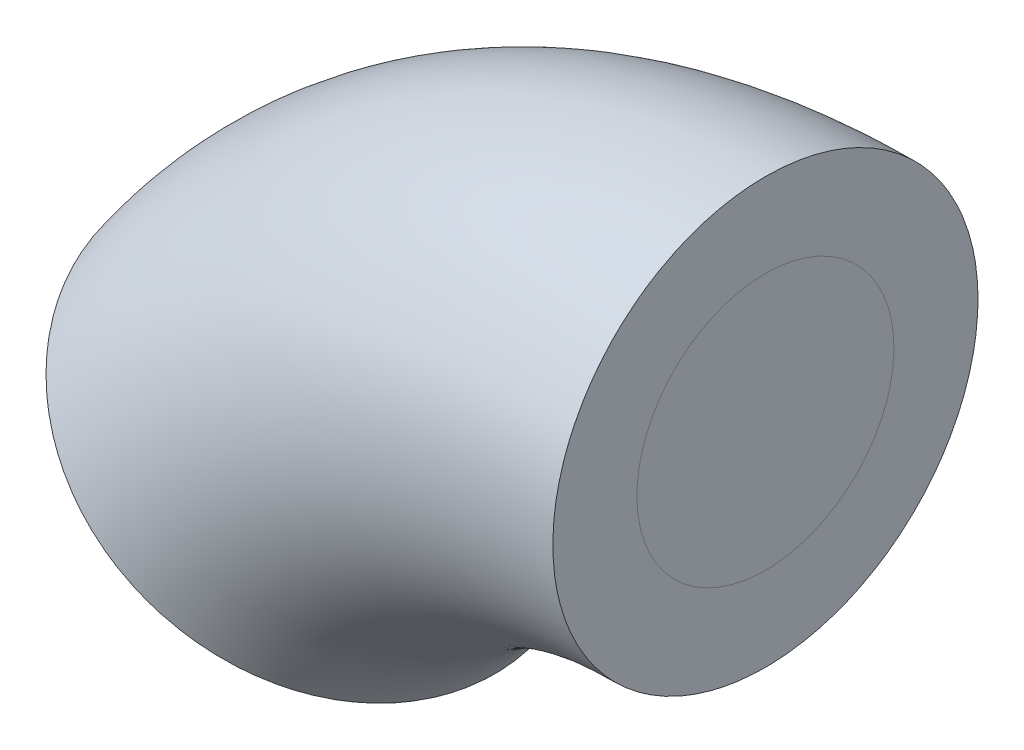
ISO-10303-21;
HEADER;
FILE_DESCRIPTION(('STEP AP214'),'2;1');
FILE_NAME('part.step','',(''),(''),'','','');
FILE_SCHEMA(('AUTOMOTIVE_DESIGN { 1 0 10303 214 1 1 1 1 }'));
ENDSEC;
DATA;
#1=APPLICATION_CONTEXT('core data for automotive mechanical design processes');
#2=APPLICATION_PROTOCOL_DEFINITION('international standard','automotive_design',2000,#1);
#3=PRODUCT_CONTEXT('',#1,'mechanical');
#4=PRODUCT('Part','Part','',(#3));
#5=PRODUCT_RELATED_PRODUCT_CATEGORY('part','',(#4));
#6=PRODUCT_DEFINITION_FORMATION('','',#4);
#7=PRODUCT_DEFINITION_CONTEXT('part definition',#1,'design');
#8=PRODUCT_DEFINITION('design','',#6,#7);
#9=PRODUCT_DEFINITION_SHAPE('','',#8);
#10=(LENGTH_UNIT() NAMED_UNIT(*) SI_UNIT(.MILLI.,.METRE.));
#11=(NAMED_UNIT(*) PLANE_ANGLE_UNIT() SI_UNIT($,.RADIAN.));
#12=(NAMED_UNIT(*) SI_UNIT($,.STERADIAN.) SOLID_ANGLE_UNIT());
#13=UNCERTAINTY_MEASURE_WITH_UNIT(LENGTH_MEASURE(1.E-05),#10,'distance_accuracy_value','');
#14=(GEOMETRIC_REPRESENTATION_CONTEXT(3) GLOBAL_UNCERTAINTY_ASSIGNED_CONTEXT((#13)) GLOBAL_UNIT_ASSIGNED_CONTEXT((#10,
#11,#12)) REPRESENTATION_CONTEXT('',''));
#15=CARTESIAN_POINT('',(0.,0.,0.));
#16=DIRECTION('',(0.,0.,1.));
#17=DIRECTION('',(1.,0.,0.));
#18=AXIS2_PLACEMENT_3D('',#15,#16,#17);
#19=CARTESIAN_POINT('',(-39.8288531987562,27.5832696008273,0.));
#20=DIRECTION('',(0.573576436350771,0.819152044289184,0.));
#21=DIRECTION('',(-0.819152044289184,0.573576436350771,0.));
#22=AXIS2_PLACEMENT_3D('',#19,#20,#21);
#23=PLANE('',#22);
#24=CARTESIAN_POINT('',(-91.4354319889623,63.7185850909438,0.));
#25=CARTESIAN_POINT('',(-91.4354319889623,63.7185850909438,-2.06167016246634));
#26=CARTESIAN_POINT('',(-91.1028653005238,63.4857193887419,-6.18495119527163));
#27=CARTESIAN_POINT('',(-89.6249737442699,62.450888580396,-12.1322656529812));
#28=CARTESIAN_POINT('',(-87.2251488980044,60.7705131326583,-17.6133047902747));
#29=CARTESIAN_POINT('',(-83.9954595333184,58.5090602934292,-22.4175252018825));
#30=CARTESIAN_POINT('',(-80.0601009921079,55.7534925773156,-26.3601940263774));
#31=CARTESIAN_POINT('',(-75.5702947094152,52.6096963730725,-29.2898722506689));
#32=CARTESIAN_POINT('',(-70.6985680389128,49.1984766342898,-31.0939547931055));
#33=CARTESIAN_POINT('',(-65.6321425938595,45.6509273458856,-31.7031213319892));
#34=CARTESIAN_POINT('',(-60.5657171488054,42.1033780574814,-31.0939547931056));
#35=CARTESIAN_POINT('',(-55.6939904783041,38.6921583186987,-29.289872250669));
#36=CARTESIAN_POINT('',(-51.20418419561,35.5483621144553,-26.3601940263774));
#37=CARTESIAN_POINT('',(-47.2688256544009,32.7927943983422,-22.4175252018826));
#38=CARTESIAN_POINT('',(-44.0391362897135,30.5313415591127,-17.6133047902748));
#39=CARTESIAN_POINT('',(-41.6393114434492,28.8509661113751,-12.1322656529813));
#40=CARTESIAN_POINT('',(-40.1614198871943,27.8161353030292,-6.18495119527165));
#41=CARTESIAN_POINT('',(-39.8288531987562,27.5832696008273,-2.06167016246634));
#42=CARTESIAN_POINT('',(-39.8288531987562,27.5832696008273,2.06167016246634));
#43=CARTESIAN_POINT('',(-40.1614198871945,27.8161353030292,6.18495119527163));
#44=CARTESIAN_POINT('',(-41.639311443449,28.8509661113751,12.1322656529812));
#45=CARTESIAN_POINT('',(-44.0391362897136,30.5313415591127,17.6133047902747));
#46=CARTESIAN_POINT('',(-47.2688256544006,32.7927943983421,22.4175252018825));
#47=CARTESIAN_POINT('',(-51.2041841956104,35.5483621144555,26.3601940263773));
#48=CARTESIAN_POINT('',(-55.6939904783037,38.6921583186984,29.2898722506689));
#49=CARTESIAN_POINT('',(-60.5657171488055,42.1033780574815,31.0939547931055));
#50=CARTESIAN_POINT('',(-65.6321425938594,45.6509273458855,31.7031213319893));
#51=CARTESIAN_POINT('',(-70.6985680389129,49.1984766342897,31.0939547931055));
#52=CARTESIAN_POINT('',(-75.5702947094149,52.6096963730726,29.289872250669));
#53=CARTESIAN_POINT('',(-80.0601009921084,55.7534925773156,26.3601940263773));
#54=CARTESIAN_POINT('',(-83.9954595333177,58.509060293429,22.4175252018826));
#55=CARTESIAN_POINT('',(-87.2251488980051,60.7705131326585,17.6133047902747));
#56=CARTESIAN_POINT('',(-89.6249737442695,62.4508885803959,12.1322656529812));
#57=CARTESIAN_POINT('',(-91.1028653005242,63.4857193887419,6.18495119527165));
#58=CARTESIAN_POINT('',(-91.4354319889623,63.7185850909438,2.06167016246634));
#59=CARTESIAN_POINT('',(-91.4354319889623,63.7185850909438,0.));
#60=B_SPLINE_CURVE_WITH_KNOTS('',3,(#24,#25,#26,#27,#28,#29,#30,#31,#32,#33,#34,#35,#36,#37,#38,
#39,#40,#41,#42,#43,#44,#45,#46,#47,#48,#49,#50,#51,#52,#53,#54,#55,#56,#57,#58,#59),
.UNSPECIFIED.,.T.,.F.,(4,1,1,1,1,1,1,1,1,1,1,1,1,1,1,1,2,1,1,1,1,1,1,1,1,1,1,1,1,1,1,1,4),(0.,
0.03125,0.0625,0.09375,0.125,0.15625,0.1875,0.21875,0.25,0.28125,0.3125,0.34375,0.375,0.40625,
0.4375,0.46875,0.5,0.53125,0.5625,0.59375,0.625,0.65625,0.6875,0.71875,0.75,0.78125,0.8125,
0.84375,0.875,0.90625,0.9375,0.96875,1.),.UNSPECIFIED.);
#61=CARTESIAN_POINT('',(-91.4354319889623,63.7185850909438,0.));
#62=VERTEX_POINT('',#61);
#63=EDGE_CURVE('E49',#62,#62,#60,.F.);
#64=ORIENTED_EDGE('',*,*,#63,.F.);
#65=EDGE_LOOP('',(#64));
#66=FACE_BOUND('',#65,.T.);
#67=CARTESIAN_POINT('',(-65.6321425938655,45.6509273458765,6.69075019069099E-05));
#68=DIRECTION('',(0.573576436350771,0.819152044289184,0.));
#69=DIRECTION('',(-0.819152044289184,0.573576436350771,0.));
#70=AXIS2_PLACEMENT_3D('',#67,#68,#69);
#71=CIRCLE('',#70,19.05);
#72=CARTESIAN_POINT('',(-81.2369890375744,56.5775584583587,6.69075019069099E-05));
#73=VERTEX_POINT('',#72);
#74=EDGE_CURVE('E10',#73,#73,#71,.F.);
#75=ORIENTED_EDGE('',*,*,#74,.F.);
#76=EDGE_LOOP('',(#75));
#77=FACE_BOUND('',#76,.T.);
#78=ADVANCED_FACE('F34',(#66,#77),#23,.F.);
#79=CARTESIAN_POINT('',(0.250000000000005,48.447,0.));
#80=DIRECTION('',(1.,0.,0.));
#81=DIRECTION('',(0.,1.,0.));
#82=AXIS2_PLACEMENT_3D('',#79,#80,#81);
#83=PLANE('',#82);
#84=CARTESIAN_POINT('',(0.250000000000005,111.447,0.));
#85=CARTESIAN_POINT('',(0.250000000000005,111.447,-2.06167016246634));
#86=CARTESIAN_POINT('',(0.250000000000005,111.041011037686,-6.18495119527165));
#87=CARTESIAN_POINT('',(0.250000000000005,109.236838580865,-12.1322656529812));
#88=CARTESIAN_POINT('',(0.250000000000005,106.307193391067,-17.6133047902748));
#89=CARTESIAN_POINT('',(0.250000000000005,102.364470685064,-22.4175252018824));
#90=CARTESIAN_POINT('',(0.250000000000005,97.56028498029,-26.3601940263775));
#91=CARTESIAN_POINT('',(0.250000000000005,92.0792435619162,-29.2898722506688));
#92=CARTESIAN_POINT('',(0.250000000000005,86.1319634391759,-31.0939547931055));
#93=CARTESIAN_POINT('',(0.250000000000005,79.9470000000004,-31.7031213319893));
#94=CARTESIAN_POINT('',(0.250000000000005,73.7620365608236,-31.0939547931054));
#95=CARTESIAN_POINT('',(0.250000000000005,67.814756438084,-29.289872250669));
#96=CARTESIAN_POINT('',(0.250000000000005,62.3337150197099,-26.3601940263773));
#97=CARTESIAN_POINT('',(0.250000000000006,57.529529314936,-22.4175252018826));
#98=CARTESIAN_POINT('',(0.250000000000005,53.5868066089328,-17.6133047902747));
#99=CARTESIAN_POINT('',(0.250000000000005,50.6571614191347,-12.1322656529812));
#100=CARTESIAN_POINT('',(0.250000000000005,48.852988962314,-6.18495119527164));
#101=CARTESIAN_POINT('',(0.250000000000005,48.447,-2.06167016246634));
#102=CARTESIAN_POINT('',(0.250000000000005,48.447,2.06167016246635));
#103=CARTESIAN_POINT('',(0.250000000000005,48.8529889623139,6.18495119527163));
#104=CARTESIAN_POINT('',(0.250000000000006,50.6571614191346,12.1322656529812));
#105=CARTESIAN_POINT('',(0.250000000000005,53.5868066089329,17.6133047902746));
#106=CARTESIAN_POINT('',(0.250000000000006,57.5295293149358,22.4175252018826));
#107=CARTESIAN_POINT('',(0.250000000000006,62.3337150197101,26.3601940263772));
#108=CARTESIAN_POINT('',(0.250000000000005,67.8147564380839,29.289872250669));
#109=CARTESIAN_POINT('',(0.250000000000006,73.7620365608238,31.0939547931054));
#110=CARTESIAN_POINT('',(0.250000000000005,79.9470000000002,31.7031213319894));
#111=CARTESIAN_POINT('',(0.250000000000005,86.1319634391759,31.0939547931054));
#112=CARTESIAN_POINT('',(0.250000000000005,92.0792435619166,29.289872250669));
#113=CARTESIAN_POINT('',(0.250000000000005,97.5602849802896,26.3601940263772));
#114=CARTESIAN_POINT('',(0.250000000000005,102.364470685064,22.4175252018826));
#115=CARTESIAN_POINT('',(0.250000000000005,106.307193391067,17.6133047902747));
#116=CARTESIAN_POINT('',(0.250000000000005,109.236838580865,12.1322656529812));
#117=CARTESIAN_POINT('',(0.250000000000005,111.041011037686,6.18495119527164));
#118=CARTESIAN_POINT('',(0.250000000000005,111.447,2.06167016246634));
#119=CARTESIAN_POINT('',(0.250000000000005,111.447,0.));
#120=B_SPLINE_CURVE_WITH_KNOTS('',3,(#84,#85,#86,#87,#88,#89,#90,#91,#92,#93,#94,#95,#96,#97,
#98,#99,#100,#101,#102,#103,#104,#105,#106,#107,#108,#109,#110,#111,#112,#113,#114,#115,#116,
#117,#118,#119),.UNSPECIFIED.,.T.,.F.,(4,1,1,1,1,1,1,1,1,1,1,1,1,1,1,1,2,1,1,1,1,1,1,1,1,1,1,1,
1,1,1,1,4),(0.,0.03125,0.0625,0.09375,0.125,0.15625,0.1875,0.21875,0.25,0.28125,0.3125,0.34375,
0.375,0.40625,0.4375,0.46875,0.5,0.53125,0.5625,0.59375,0.625,0.65625,0.6875,0.71875,0.75,
0.78125,0.8125,0.84375,0.875,0.90625,0.9375,0.96875,1.),.UNSPECIFIED.);
#121=CARTESIAN_POINT('',(0.250000000000005,111.447,0.));
#122=VERTEX_POINT('',#121);
#123=EDGE_CURVE('E57',#122,#122,#120,.T.);
#124=ORIENTED_EDGE('',*,*,#123,.F.);
#125=EDGE_LOOP('',(#124));
#126=FACE_BOUND('',#125,.T.);
#127=CARTESIAN_POINT('',(0.250000000000014,79.9470216520437,0.));
#128=DIRECTION('',(1.,0.,0.));
#129=DIRECTION('',(0.,1.,0.));
#130=AXIS2_PLACEMENT_3D('',#127,#128,#129);
#131=CIRCLE('',#130,19.05);
#132=CARTESIAN_POINT('',(0.250000000000019,98.9970216520437,0.));
#133=VERTEX_POINT('',#132);
#134=EDGE_CURVE('E42',#133,#133,#131,.F.);
#135=ORIENTED_EDGE('',*,*,#134,.T.);
#136=EDGE_LOOP('',(#135));
#137=FACE_BOUND('',#136,.T.);
#138=ADVANCED_FACE('F78',(#126,#137),#83,.T.);
#139=ORIENTED_EDGE('',*,*,#134,.F.);
#140=EDGE_LOOP('',(#139));
#141=FACE_BOUND('',#140,.T.);
#142=ADVANCED_FACE('F36',(#141),#83,.T.);
#143=ORIENTED_EDGE('',*,*,#74,.T.);
#144=EDGE_LOOP('',(#143));
#145=FACE_BOUND('',#144,.T.);
#146=ADVANCED_FACE('F84',(#145),#23,.F.);
#147=CARTESIAN_POINT('',(0.250000000000005,111.447,0.));
#148=CARTESIAN_POINT('',(-40.2166542952319,111.447,0.));
#149=CARTESIAN_POINT('',(-72.4824245796629,90.7862848443027,0.));
#150=CARTESIAN_POINT('',(-91.4354319889623,63.7185850909438,0.));
#151=CARTESIAN_POINT('',(0.250000000000005,111.447,-2.06167016246634));
#152=CARTESIAN_POINT('',(-40.2166542952319,111.447,-2.06167016246634));
#153=CARTESIAN_POINT('',(-72.4824245796629,90.7862848443027,-2.06167016246634));
#154=CARTESIAN_POINT('',(-91.4354319889623,63.7185850909438,-2.06167016246634));
#155=CARTESIAN_POINT('',(0.250000000000005,111.041011037686,-6.18495119527165));
#156=CARTESIAN_POINT('',(-40.0562949434534,111.028758675146,-6.18495119527164));
#157=CARTESIAN_POINT('',(-72.2069006025991,90.450592365342,-6.18495119527164));
#158=CARTESIAN_POINT('',(-91.1028653005238,63.4857193887419,-6.18495119527163));
#159=CARTESIAN_POINT('',(0.250000000000005,109.236838580865,-12.1322656529812));
#160=CARTESIAN_POINT('',(-39.3594612952186,109.19244795635,-12.1322656529812));
#161=CARTESIAN_POINT('',(-70.9996615529142,88.9731983693618,-12.1322656529812));
#162=CARTESIAN_POINT('',(-89.6249737442699,62.450888580396,-12.1322656529812));
#163=CARTESIAN_POINT('',(0.250000000000005,106.307193391067,-17.6133047902748));
#164=CARTESIAN_POINT('',(-38.2439330251405,106.233230274971,-17.6133047902748));
#165=CARTESIAN_POINT('',(-69.0567213941526,86.5887659001713,-17.6133047902748));
#166=CARTESIAN_POINT('',(-87.2251488980044,60.7705131326583,-17.6133047902747));
#167=CARTESIAN_POINT('',(0.250000000000005,102.364470685064,-22.4175252018824));
#168=CARTESIAN_POINT('',(-36.7589636446115,102.273759901626,-22.4175252018825));
#169=CARTESIAN_POINT('',(-66.4596391266641,83.3946578290654,-22.4175252018825));
#170=CARTESIAN_POINT('',(-83.9954595333184,58.5090602934292,-22.4175252018825));
#171=CARTESIAN_POINT('',(0.250000000000005,97.56028498029,-26.3601940263775));
#172=CARTESIAN_POINT('',(-34.9645155217925,97.4703357296048,-26.3601940263774));
#173=CARTESIAN_POINT('',(-63.3113914643355,79.5163069720308,-26.3601940263774));
#174=CARTESIAN_POINT('',(-80.0601009921079,55.7534925773156,-26.3601940263774));
#175=CARTESIAN_POINT('',(0.250000000000005,92.0792435619162,-29.2898722506688));
#176=CARTESIAN_POINT('',(-32.9295597225597,92.0075597887409,-29.2898722506689));
#177=CARTESIAN_POINT('',(-59.7329725164841,75.1027596503983,-29.2898722506689));
#178=CARTESIAN_POINT('',(-75.5702947094152,52.6096963730725,-29.2898722506689));
#179=CARTESIAN_POINT('',(0.250000000000005,86.1319634391759,-31.0939547931055));
#180=CARTESIAN_POINT('',(-30.7301692856661,86.0923467798525,-31.0939547931055));
#181=CARTESIAN_POINT('',(-55.8595803381811,70.3216778034094,-31.0939547931055));
#182=CARTESIAN_POINT('',(-70.6985680389128,49.1984766342898,-31.0939547931055));
#183=CARTESIAN_POINT('',(0.250000000000005,79.9470000000004,-31.7031213319893));
#184=CARTESIAN_POINT('',(-28.4473153363933,79.9470000000003,-31.7031213319893));
#185=CARTESIAN_POINT('',(-51.8362091575549,65.3535621840905,-31.7031213319893));
#186=CARTESIAN_POINT('',(-65.6321425938595,45.6509273458856,-31.7031213319892));
#187=CARTESIAN_POINT('',(0.250000000000005,73.7620365608236,-31.0939547931054));
#188=CARTESIAN_POINT('',(-26.1644613871203,73.8016532201471,-31.0939547931055));
#189=CARTESIAN_POINT('',(-47.8128379769281,60.3854465647712,-31.0939547931055));
#190=CARTESIAN_POINT('',(-60.5657171488054,42.1033780574814,-31.0939547931056));
#191=CARTESIAN_POINT('',(0.250000000000005,67.814756438084,-29.289872250669));
#192=CARTESIAN_POINT('',(-23.965070950227,67.8864402112593,-29.289872250669));
#193=CARTESIAN_POINT('',(-43.9394457986258,55.6043647177826,-29.289872250669));
#194=CARTESIAN_POINT('',(-55.6939904783041,38.6921583186987,-29.289872250669));
#195=CARTESIAN_POINT('',(0.250000000000005,62.3337150197099,-26.3601940263773));
#196=CARTESIAN_POINT('',(-21.9301151509937,62.423664270395,-26.3601940263773));
#197=CARTESIAN_POINT('',(-40.3610268507735,51.1908173961497,-26.3601940263773));
#198=CARTESIAN_POINT('',(-51.20418419561,35.5483621144553,-26.3601940263774));
#199=CARTESIAN_POINT('',(0.250000000000006,57.529529314936,-22.4175252018826));
#200=CARTESIAN_POINT('',(-20.1356670281752,57.6202400983743,-22.4175252018826));
#201=CARTESIAN_POINT('',(-37.2127791884458,47.3124665391155,-22.4175252018826));
#202=CARTESIAN_POINT('',(-47.2688256544009,32.7927943983422,-22.4175252018826));
#203=CARTESIAN_POINT('',(0.250000000000005,53.5868066089328,-17.6133047902747));
#204=CARTESIAN_POINT('',(-18.6506976476457,53.6607697250286,-17.6133047902747));
#205=CARTESIAN_POINT('',(-34.6156969209564,44.1183584680093,-17.6133047902748));
#206=CARTESIAN_POINT('',(-44.0391362897135,30.5313415591127,-17.6133047902748));
#207=CARTESIAN_POINT('',(0.250000000000005,50.6571614191347,-12.1322656529812));
#208=CARTESIAN_POINT('',(-17.535169377568,50.7015520436504,-12.1322656529812));
#209=CARTESIAN_POINT('',(-32.6727567621956,41.7339259988189,-12.1322656529812));
#210=CARTESIAN_POINT('',(-41.6393114434492,28.8509661113751,-12.1322656529813));
#211=CARTESIAN_POINT('',(0.250000000000005,48.852988962314,-6.18495119527164));
#212=CARTESIAN_POINT('',(-16.8383357293329,48.8652413248544,-6.18495119527164));
#213=CARTESIAN_POINT('',(-31.4655177125101,40.2565320028387,-6.18495119527165));
#214=CARTESIAN_POINT('',(-40.1614198871943,27.8161353030292,-6.18495119527165));
#215=CARTESIAN_POINT('',(0.250000000000005,48.447,-2.06167016246634));
#216=CARTESIAN_POINT('',(-16.6779763775545,48.447,-2.06167016246634));
#217=CARTESIAN_POINT('',(-31.1899937354466,39.920839523878,-2.06167016246634));
#218=CARTESIAN_POINT('',(-39.8288531987562,27.5832696008273,-2.06167016246634));
#219=CARTESIAN_POINT('',(0.250000000000005,48.447,2.06167016246635));
#220=CARTESIAN_POINT('',(-16.6779763775545,48.447,2.06167016246634));
#221=CARTESIAN_POINT('',(-31.1899937354466,39.920839523878,2.06167016246634));
#222=CARTESIAN_POINT('',(-39.8288531987562,27.5832696008273,2.06167016246634));
#223=CARTESIAN_POINT('',(0.250000000000005,48.8529889623139,6.18495119527163));
#224=CARTESIAN_POINT('',(-16.8383357293329,48.8652413248544,6.18495119527162));
#225=CARTESIAN_POINT('',(-31.4655177125102,40.2565320028387,6.18495119527163));
#226=CARTESIAN_POINT('',(-40.1614198871945,27.8161353030292,6.18495119527163));
#227=CARTESIAN_POINT('',(0.250000000000006,50.6571614191346,12.1322656529812));
#228=CARTESIAN_POINT('',(-17.5351693775679,50.7015520436503,12.1322656529812));
#229=CARTESIAN_POINT('',(-32.6727567621954,41.7339259988189,12.1322656529812));
#230=CARTESIAN_POINT('',(-41.639311443449,28.8509661113751,12.1322656529812));
#231=CARTESIAN_POINT('',(0.250000000000005,53.5868066089329,17.6133047902746));
#232=CARTESIAN_POINT('',(-18.6506976476458,53.6607697250287,17.6133047902747));
#233=CARTESIAN_POINT('',(-34.6156969209565,44.1183584680094,17.6133047902747));
#234=CARTESIAN_POINT('',(-44.0391362897136,30.5313415591127,17.6133047902747));
#235=CARTESIAN_POINT('',(0.250000000000006,57.5295293149358,22.4175252018826));
#236=CARTESIAN_POINT('',(-20.1356670281751,57.6202400983741,22.4175252018826));
#237=CARTESIAN_POINT('',(-37.2127791884456,47.3124665391153,22.4175252018826));
#238=CARTESIAN_POINT('',(-47.2688256544006,32.7927943983421,22.4175252018825));
#239=CARTESIAN_POINT('',(0.250000000000006,62.3337150197101,26.3601940263772));
#240=CARTESIAN_POINT('',(-21.9301151509938,62.4236642703952,26.3601940263773));
#241=CARTESIAN_POINT('',(-40.3610268507738,51.1908173961499,26.3601940263773));
#242=CARTESIAN_POINT('',(-51.2041841956104,35.5483621144555,26.3601940263773));
#243=CARTESIAN_POINT('',(0.250000000000005,67.8147564380839,29.289872250669));
#244=CARTESIAN_POINT('',(-23.9650709502268,67.8864402112592,29.289872250669));
#245=CARTESIAN_POINT('',(-43.9394457986255,55.6043647177824,29.289872250669));
#246=CARTESIAN_POINT('',(-55.6939904783037,38.6921583186984,29.2898722506689));
#247=CARTESIAN_POINT('',(0.250000000000006,73.7620365608238,31.0939547931054));
#248=CARTESIAN_POINT('',(-26.1644613871203,73.8016532201473,31.0939547931054));
#249=CARTESIAN_POINT('',(-47.8128379769281,60.3854465647714,31.0939547931055));
#250=CARTESIAN_POINT('',(-60.5657171488055,42.1033780574815,31.0939547931055));
#251=CARTESIAN_POINT('',(0.250000000000005,79.9470000000002,31.7031213319894));
#252=CARTESIAN_POINT('',(-28.4473153363933,79.9470000000001,31.7031213319893));
#253=CARTESIAN_POINT('',(-51.8362091575548,65.3535621840904,31.7031213319893));
#254=CARTESIAN_POINT('',(-65.6321425938594,45.6509273458855,31.7031213319893));
#255=CARTESIAN_POINT('',(0.250000000000005,86.1319634391759,31.0939547931054));
#256=CARTESIAN_POINT('',(-30.7301692856661,86.0923467798525,31.0939547931054));
#257=CARTESIAN_POINT('',(-55.8595803381812,70.3216778034093,31.0939547931054));
#258=CARTESIAN_POINT('',(-70.6985680389129,49.1984766342897,31.0939547931055));
#259=CARTESIAN_POINT('',(0.250000000000005,92.0792435619166,29.289872250669));
#260=CARTESIAN_POINT('',(-32.9295597225596,92.0075597887411,29.289872250669));
#261=CARTESIAN_POINT('',(-59.7329725164839,75.1027596503984,29.289872250669));
#262=CARTESIAN_POINT('',(-75.5702947094149,52.6096963730726,29.289872250669));
#263=CARTESIAN_POINT('',(0.250000000000005,97.5602849802896,26.3601940263772));
#264=CARTESIAN_POINT('',(-34.9645155217927,97.4703357296046,26.3601940263773));
#265=CARTESIAN_POINT('',(-63.3113914643358,79.5163069720307,26.3601940263773));
#266=CARTESIAN_POINT('',(-80.0601009921084,55.7534925773156,26.3601940263773));
#267=CARTESIAN_POINT('',(0.250000000000005,102.364470685064,22.4175252018826));
#268=CARTESIAN_POINT('',(-36.7589636446113,102.273759901626,22.4175252018826));
#269=CARTESIAN_POINT('',(-66.4596391266637,83.3946578290654,22.4175252018826));
#270=CARTESIAN_POINT('',(-83.9954595333177,58.509060293429,22.4175252018826));
#271=CARTESIAN_POINT('',(0.250000000000005,106.307193391067,17.6133047902747));
#272=CARTESIAN_POINT('',(-38.2439330251407,106.233230274971,17.6133047902747));
#273=CARTESIAN_POINT('',(-69.056721394153,86.5887659001714,17.6133047902747));
#274=CARTESIAN_POINT('',(-87.2251488980051,60.7705131326585,17.6133047902747));
#275=CARTESIAN_POINT('',(0.250000000000005,109.236838580865,12.1322656529812));
#276=CARTESIAN_POINT('',(-39.3594612952185,109.19244795635,12.1322656529812));
#277=CARTESIAN_POINT('',(-70.9996615529139,88.9731983693617,12.1322656529812));
#278=CARTESIAN_POINT('',(-89.6249737442695,62.4508885803959,12.1322656529812));
#279=CARTESIAN_POINT('',(0.250000000000005,111.041011037686,6.18495119527164));
#280=CARTESIAN_POINT('',(-40.0562949434536,111.028758675146,6.18495119527164));
#281=CARTESIAN_POINT('',(-72.2069006025993,90.4505923653421,6.18495119527165));
#282=CARTESIAN_POINT('',(-91.1028653005242,63.4857193887419,6.18495119527165));
#283=CARTESIAN_POINT('',(0.250000000000005,111.447,2.06167016246634));
#284=CARTESIAN_POINT('',(-40.2166542952319,111.447,2.06167016246634));
#285=CARTESIAN_POINT('',(-72.4824245796629,90.7862848443027,2.06167016246634));
#286=CARTESIAN_POINT('',(-91.4354319889623,63.7185850909438,2.06167016246634));
#287=CARTESIAN_POINT('',(0.250000000000005,111.447,0.));
#288=CARTESIAN_POINT('',(-40.2166542952319,111.447,0.));
#289=CARTESIAN_POINT('',(-72.4824245796629,90.7862848443027,0.));
#290=CARTESIAN_POINT('',(-91.4354319889623,63.7185850909438,0.));
#291=B_SPLINE_SURFACE_WITH_KNOTS('',3,3,((#147,#148,#149,#150),(#151,#152,#153,#154),(#155,#156,
#157,#158),(#159,#160,#161,#162),(#163,#164,#165,#166),(#167,#168,#169,#170),(#171,#172,#173,
#174),(#175,#176,#177,#178),(#179,#180,#181,#182),(#183,#184,#185,#186),(#187,#188,#189,#190),
(#191,#192,#193,#194),(#195,#196,#197,#198),(#199,#200,#201,#202),(#203,#204,#205,#206),(#207,
#208,#209,#210),(#211,#212,#213,#214),(#215,#216,#217,#218),(#219,#220,#221,#222),(#223,#224,
#225,#226),(#227,#228,#229,#230),(#231,#232,#233,#234),(#235,#236,#237,#238),(#239,#240,#241,
#242),(#243,#244,#245,#246),(#247,#248,#249,#250),(#251,#252,#253,#254),(#255,#256,#257,#258),
(#259,#260,#261,#262),(#263,#264,#265,#266),(#267,#268,#269,#270),(#271,#272,#273,#274),(#275,
#276,#277,#278),(#279,#280,#281,#282),(#283,#284,#285,#286),(#287,#288,#289,#290)),
.UNSPECIFIED.,.T.,.F.,.F.,(4,1,1,1,1,1,1,1,1,1,1,1,1,1,1,1,2,1,1,1,1,1,1,1,1,1,1,1,1,1,1,1,4),
(4,4),(0.,0.03125,0.0625,0.09375,0.125,0.15625,0.1875,0.21875,0.25,0.28125,0.3125,0.34375,0.375,
0.40625,0.4375,0.46875,0.5,0.53125,0.5625,0.59375,0.625,0.65625,0.6875,0.71875,0.75,0.78125,
0.8125,0.84375,0.875,0.90625,0.9375,0.96875,1.),(0.,1.),.UNSPECIFIED.);
#292=ORIENTED_EDGE('',*,*,#63,.T.);
#293=EDGE_LOOP('',(#292));
#294=FACE_BOUND('',#293,.T.);
#295=ORIENTED_EDGE('',*,*,#123,.T.);
#296=EDGE_LOOP('',(#295));
#297=FACE_BOUND('',#296,.T.);
#298=ADVANCED_FACE('F76',(#294,#297),#291,.T.);
#299=CLOSED_SHELL('',(#78,#138,#142,#146,#298));
#300=MANIFOLD_SOLID_BREP('B2',#299);
#301=ADVANCED_BREP_SHAPE_REPRESENTATION('',(#18,#300),#14);
#302=SHAPE_DEFINITION_REPRESENTATION(#9,#301);
ENDSEC;
END-ISO-10303-21;
